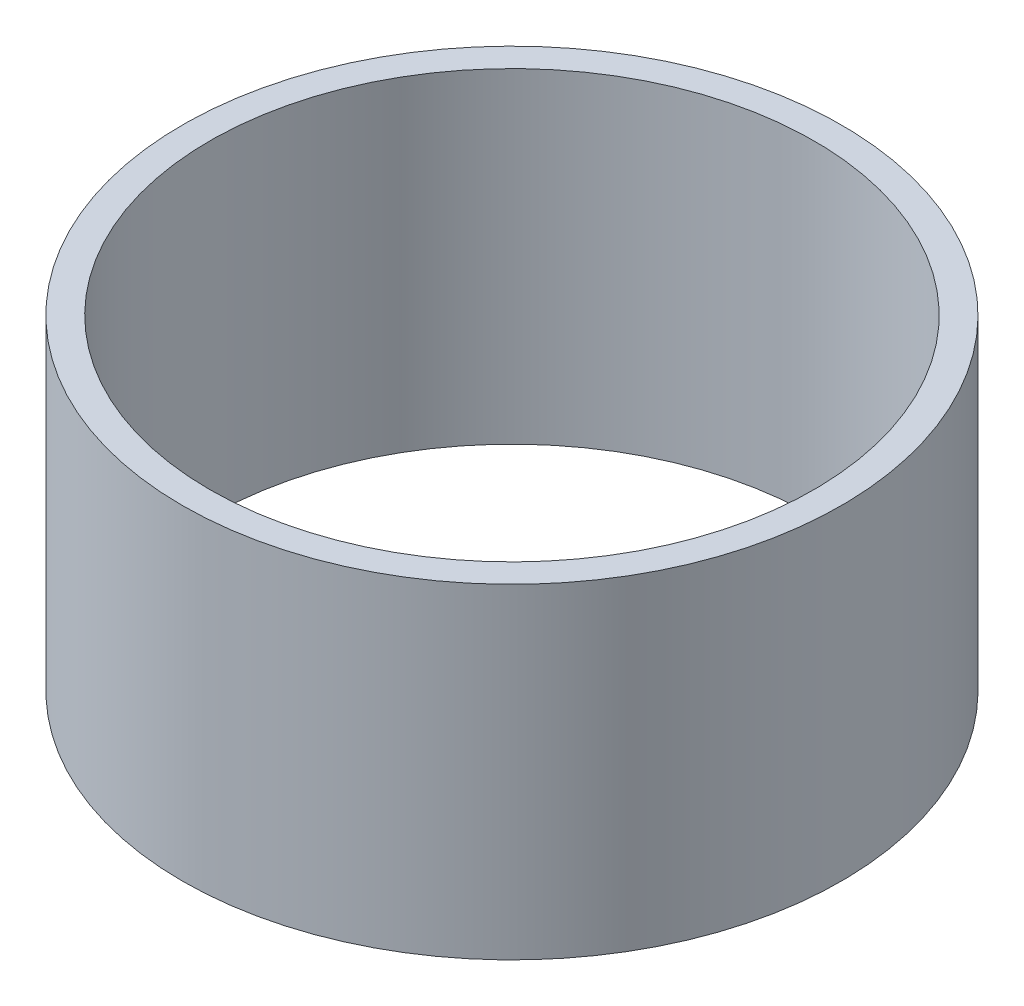
ISO-10303-21;
HEADER;
FILE_DESCRIPTION(('STEP AP214'),'2;1');
FILE_NAME('part.step','',(''),(''),'','','');
FILE_SCHEMA(('AUTOMOTIVE_DESIGN { 1 0 10303 214 1 1 1 1 }'));
ENDSEC;
DATA;
#1=APPLICATION_CONTEXT('core data for automotive mechanical design processes');
#2=APPLICATION_PROTOCOL_DEFINITION('international standard','automotive_design',2000,#1);
#3=PRODUCT_CONTEXT('',#1,'mechanical');
#4=PRODUCT('Part','Part','',(#3));
#5=PRODUCT_RELATED_PRODUCT_CATEGORY('part','',(#4));
#6=PRODUCT_DEFINITION_FORMATION('','',#4);
#7=PRODUCT_DEFINITION_CONTEXT('part definition',#1,'design');
#8=PRODUCT_DEFINITION('design','',#6,#7);
#9=PRODUCT_DEFINITION_SHAPE('','',#8);
#10=(LENGTH_UNIT() NAMED_UNIT(*) SI_UNIT(.MILLI.,.METRE.));
#11=(NAMED_UNIT(*) PLANE_ANGLE_UNIT() SI_UNIT($,.RADIAN.));
#12=(NAMED_UNIT(*) SI_UNIT($,.STERADIAN.) SOLID_ANGLE_UNIT());
#13=UNCERTAINTY_MEASURE_WITH_UNIT(LENGTH_MEASURE(1.E-05),#10,'distance_accuracy_value','');
#14=(GEOMETRIC_REPRESENTATION_CONTEXT(3) GLOBAL_UNCERTAINTY_ASSIGNED_CONTEXT((#13)) GLOBAL_UNIT_ASSIGNED_CONTEXT((#10,
#11,#12)) REPRESENTATION_CONTEXT('',''));
#15=CARTESIAN_POINT('',(0.,0.,0.));
#16=DIRECTION('',(0.,0.,1.));
#17=DIRECTION('',(1.,0.,0.));
#18=AXIS2_PLACEMENT_3D('',#15,#16,#17);
#19=CARTESIAN_POINT('',(0.,37.6047,0.));
#20=DIRECTION('',(0.,1.,0.));
#21=DIRECTION('',(0.,0.,1.));
#22=AXIS2_PLACEMENT_3D('',#19,#20,#21);
#23=PLANE('',#22);
#24=CARTESIAN_POINT('',(0.,37.6047,0.));
#25=DIRECTION('',(0.,1.,0.));
#26=DIRECTION('',(0.,0.,1.));
#27=AXIS2_PLACEMENT_3D('',#24,#25,#26);
#28=CIRCLE('',#27,76.2);
#29=CARTESIAN_POINT('',(0.,37.6047,76.2));
#30=VERTEX_POINT('',#29);
#31=EDGE_CURVE('E10',#30,#30,#28,.T.);
#32=ORIENTED_EDGE('',*,*,#31,.T.);
#33=EDGE_LOOP('',(#32));
#34=FACE_BOUND('',#33,.T.);
#35=CARTESIAN_POINT('',(0.,37.6047,0.));
#36=DIRECTION('',(0.,1.,0.));
#37=DIRECTION('',(0.,0.,1.));
#38=AXIS2_PLACEMENT_3D('',#35,#36,#37);
#39=CIRCLE('',#38,69.85);
#40=CARTESIAN_POINT('',(0.,37.6047,69.85));
#41=VERTEX_POINT('',#40);
#42=EDGE_CURVE('E44',#41,#41,#39,.T.);
#43=ORIENTED_EDGE('',*,*,#42,.F.);
#44=EDGE_LOOP('',(#43));
#45=FACE_BOUND('',#44,.T.);
#46=ADVANCED_FACE('F33',(#34,#45),#23,.T.);
#47=CARTESIAN_POINT('',(0.,-37.6047,0.));
#48=DIRECTION('',(0.,1.,0.));
#49=DIRECTION('',(0.,0.,1.));
#50=AXIS2_PLACEMENT_3D('',#47,#48,#49);
#51=PLANE('',#50);
#52=CARTESIAN_POINT('',(0.,-37.6047,0.));
#53=DIRECTION('',(0.,1.,0.));
#54=DIRECTION('',(0.,0.,1.));
#55=AXIS2_PLACEMENT_3D('',#52,#53,#54);
#56=CIRCLE('',#55,76.2);
#57=CARTESIAN_POINT('',(0.,-37.6047,76.2));
#58=VERTEX_POINT('',#57);
#59=EDGE_CURVE('E37',#58,#58,#56,.T.);
#60=ORIENTED_EDGE('',*,*,#59,.F.);
#61=EDGE_LOOP('',(#60));
#62=FACE_BOUND('',#61,.T.);
#63=CARTESIAN_POINT('',(0.,-37.6047,0.));
#64=DIRECTION('',(0.,1.,0.));
#65=DIRECTION('',(0.,0.,1.));
#66=AXIS2_PLACEMENT_3D('',#63,#64,#65);
#67=CIRCLE('',#66,69.85);
#68=CARTESIAN_POINT('',(0.,-37.6047,69.85));
#69=VERTEX_POINT('',#68);
#70=EDGE_CURVE('E46',#69,#69,#67,.T.);
#71=ORIENTED_EDGE('',*,*,#70,.T.);
#72=EDGE_LOOP('',(#71));
#73=FACE_BOUND('',#72,.T.);
#74=ADVANCED_FACE('F56',(#62,#73),#51,.F.);
#75=CARTESIAN_POINT('',(0.,37.6047,0.));
#76=DIRECTION('',(0.,-1.,0.));
#77=DIRECTION('',(0.,0.,-1.));
#78=AXIS2_PLACEMENT_3D('',#75,#76,#77);
#79=CYLINDRICAL_SURFACE('',#78,76.2);
#80=ORIENTED_EDGE('',*,*,#31,.F.);
#81=EDGE_LOOP('',(#80));
#82=FACE_BOUND('',#81,.T.);
#83=ORIENTED_EDGE('',*,*,#59,.T.);
#84=EDGE_LOOP('',(#83));
#85=FACE_BOUND('',#84,.T.);
#86=ADVANCED_FACE('F35',(#82,#85),#79,.T.);
#87=CARTESIAN_POINT('',(0.,37.6047,0.));
#88=DIRECTION('',(0.,-1.,0.));
#89=DIRECTION('',(0.,0.,-1.));
#90=AXIS2_PLACEMENT_3D('',#87,#88,#89);
#91=CYLINDRICAL_SURFACE('',#90,69.85);
#92=ORIENTED_EDGE('',*,*,#42,.T.);
#93=EDGE_LOOP('',(#92));
#94=FACE_BOUND('',#93,.T.);
#95=ORIENTED_EDGE('',*,*,#70,.F.);
#96=EDGE_LOOP('',(#95));
#97=FACE_BOUND('',#96,.T.);
#98=ADVANCED_FACE('F52',(#94,#97),#91,.F.);
#99=CLOSED_SHELL('',(#46,#74,#86,#98));
#100=MANIFOLD_SOLID_BREP('B2',#99);
#101=ADVANCED_BREP_SHAPE_REPRESENTATION('',(#18,#100),#14);
#102=SHAPE_DEFINITION_REPRESENTATION(#9,#101);
ENDSEC;
END-ISO-10303-21;
